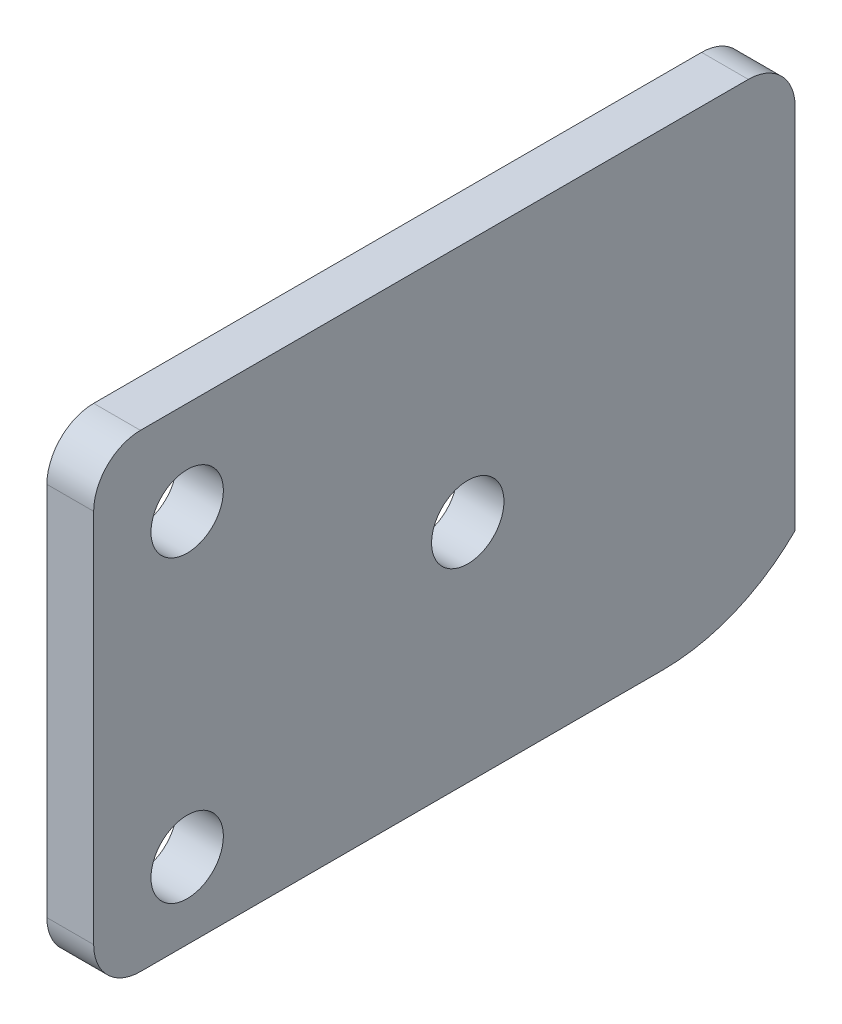
ISO-10303-21;
HEADER;
FILE_DESCRIPTION(('STEP AP214'),'2;1');
FILE_NAME('part.step','',(''),(''),'','','');
FILE_SCHEMA(('AUTOMOTIVE_DESIGN { 1 0 10303 214 1 1 1 1 }'));
ENDSEC;
DATA;
#1=APPLICATION_CONTEXT('core data for automotive mechanical design processes');
#2=APPLICATION_PROTOCOL_DEFINITION('international standard','automotive_design',2000,#1);
#3=PRODUCT_CONTEXT('',#1,'mechanical');
#4=PRODUCT('Part','Part','',(#3));
#5=PRODUCT_RELATED_PRODUCT_CATEGORY('part','',(#4));
#6=PRODUCT_DEFINITION_FORMATION('','',#4);
#7=PRODUCT_DEFINITION_CONTEXT('part definition',#1,'design');
#8=PRODUCT_DEFINITION('design','',#6,#7);
#9=PRODUCT_DEFINITION_SHAPE('','',#8);
#10=(LENGTH_UNIT() NAMED_UNIT(*) SI_UNIT(.MILLI.,.METRE.));
#11=(NAMED_UNIT(*) PLANE_ANGLE_UNIT() SI_UNIT($,.RADIAN.));
#12=(NAMED_UNIT(*) SI_UNIT($,.STERADIAN.) SOLID_ANGLE_UNIT());
#13=UNCERTAINTY_MEASURE_WITH_UNIT(LENGTH_MEASURE(1.E-05),#10,'distance_accuracy_value','');
#14=(GEOMETRIC_REPRESENTATION_CONTEXT(3) GLOBAL_UNCERTAINTY_ASSIGNED_CONTEXT((#13)) GLOBAL_UNIT_ASSIGNED_CONTEXT((#10,
#11,#12)) REPRESENTATION_CONTEXT('',''));
#15=CARTESIAN_POINT('',(0.,0.,0.));
#16=DIRECTION('',(0.,0.,1.));
#17=DIRECTION('',(1.,0.,0.));
#18=AXIS2_PLACEMENT_3D('',#15,#16,#17);
#19=CARTESIAN_POINT('',(3.175,11.1125,25.4));
#20=DIRECTION('',(0.,0.,-1.));
#21=DIRECTION('',(0.,1.,0.));
#22=AXIS2_PLACEMENT_3D('',#19,#20,#21);
#23=PLANE('',#22);
#24=DIRECTION('',(0.,-1.,0.));
#25=VECTOR('',#24,1.);
#26=CARTESIAN_POINT('',(3.175,11.1125,25.4));
#27=LINE('',#26,#25);
#28=CARTESIAN_POINT('',(3.175,7.93749999999999,25.4));
#29=VERTEX_POINT('',#28);
#30=CARTESIAN_POINT('',(3.175,-17.5416811648555,25.4));
#31=VERTEX_POINT('',#30);
#32=EDGE_CURVE('E114',#29,#31,#27,.T.);
#33=ORIENTED_EDGE('',*,*,#32,.F.);
#34=DIRECTION('',(-1.,0.,0.));
#35=VECTOR('',#34,1.);
#36=CARTESIAN_POINT('',(3.175,7.93749999999999,25.4));
#37=LINE('',#36,#35);
#38=CARTESIAN_POINT('',(0.,7.93749999999999,25.4));
#39=VERTEX_POINT('',#38);
#40=EDGE_CURVE('E48',#29,#39,#37,.T.);
#41=ORIENTED_EDGE('',*,*,#40,.T.);
#42=DIRECTION('',(0.,-1.,0.));
#43=VECTOR('',#42,1.);
#44=CARTESIAN_POINT('',(0.,11.1125,25.4));
#45=LINE('',#44,#43);
#46=CARTESIAN_POINT('',(0.,-17.5416811648555,25.4));
#47=VERTEX_POINT('',#46);
#48=EDGE_CURVE('E141',#39,#47,#45,.T.);
#49=ORIENTED_EDGE('',*,*,#48,.T.);
#50=DIRECTION('',(-1.,0.,0.));
#51=VECTOR('',#50,1.);
#52=CARTESIAN_POINT('',(3.175,-17.5416811648555,25.4));
#53=LINE('',#52,#51);
#54=EDGE_CURVE('E63',#47,#31,#53,.F.);
#55=ORIENTED_EDGE('',*,*,#54,.T.);
#56=EDGE_LOOP('',(#33,#41,#49,#55));
#57=FACE_BOUND('',#56,.T.);
#58=ADVANCED_FACE('F39',(#57),#23,.F.);
#59=CARTESIAN_POINT('',(3.175,-20.7166811648555,25.4));
#60=DIRECTION('',(0.,1.,0.));
#61=DIRECTION('',(0.,0.,1.));
#62=AXIS2_PLACEMENT_3D('',#59,#60,#61);
#63=PLANE('',#62);
#64=DIRECTION('',(0.,0.,-1.));
#65=VECTOR('',#64,1.);
#66=CARTESIAN_POINT('',(3.175,-20.7166811648555,25.4));
#67=LINE('',#66,#65);
#68=CARTESIAN_POINT('',(3.175,-20.7166811648555,22.225));
#69=VERTEX_POINT('',#68);
#70=CARTESIAN_POINT('',(3.175,-20.7166811648555,-13.2578493623623));
#71=VERTEX_POINT('',#70);
#72=EDGE_CURVE('E104',#69,#71,#67,.T.);
#73=ORIENTED_EDGE('',*,*,#72,.F.);
#74=DIRECTION('',(-1.,0.,0.));
#75=VECTOR('',#74,1.);
#76=CARTESIAN_POINT('',(3.175,-20.7166811648555,22.225));
#77=LINE('',#76,#75);
#78=CARTESIAN_POINT('',(0.,-20.7166811648555,22.225));
#79=VERTEX_POINT('',#78);
#80=EDGE_CURVE('E11',#69,#79,#77,.T.);
#81=ORIENTED_EDGE('',*,*,#80,.T.);
#82=DIRECTION('',(0.,0.,-1.));
#83=VECTOR('',#82,1.);
#84=CARTESIAN_POINT('',(0.,-20.7166811648555,25.4));
#85=LINE('',#84,#83);
#86=CARTESIAN_POINT('',(0.,-20.7166811648555,-13.2578493623623));
#87=VERTEX_POINT('',#86);
#88=EDGE_CURVE('E120',#79,#87,#85,.T.);
#89=ORIENTED_EDGE('',*,*,#88,.T.);
#90=DIRECTION('',(-1.,0.,0.));
#91=VECTOR('',#90,1.);
#92=CARTESIAN_POINT('',(3.175,-20.7166811648555,-13.2578493623623));
#93=LINE('',#92,#91);
#94=EDGE_CURVE('E117',#71,#87,#93,.T.);
#95=ORIENTED_EDGE('',*,*,#94,.F.);
#96=EDGE_LOOP('',(#73,#81,#89,#95));
#97=FACE_BOUND('',#96,.T.);
#98=ADVANCED_FACE('F118',(#97),#63,.F.);
#99=CARTESIAN_POINT('',(3.175,-8.01668116485554,-13.2578493623623));
#100=DIRECTION('',(-1.,0.,0.));
#101=DIRECTION('',(0.,0.,1.));
#102=AXIS2_PLACEMENT_3D('',#99,#100,#101);
#103=CYLINDRICAL_SURFACE('',#102,12.7);
#104=CARTESIAN_POINT('',(0.,-8.01668116485554,-13.2578493623623));
#105=DIRECTION('',(1.,0.,0.));
#106=DIRECTION('',(0.,0.,-1.));
#107=AXIS2_PLACEMENT_3D('',#104,#105,#106);
#108=CIRCLE('',#107,12.7);
#109=CARTESIAN_POINT('',(0.,-17.0100236715053,-22.225));
#110=VERTEX_POINT('',#109);
#111=EDGE_CURVE('E147',#87,#110,#108,.T.);
#112=ORIENTED_EDGE('',*,*,#111,.T.);
#113=DIRECTION('',(-1.,0.,0.));
#114=VECTOR('',#113,1.);
#115=CARTESIAN_POINT('',(3.175,-17.0100236715053,-22.225));
#116=LINE('',#115,#114);
#117=CARTESIAN_POINT('',(3.175,-17.0100236715053,-22.225));
#118=VERTEX_POINT('',#117);
#119=EDGE_CURVE('E125',#118,#110,#116,.T.);
#120=ORIENTED_EDGE('',*,*,#119,.F.);
#121=CARTESIAN_POINT('',(3.175,-8.01668116485554,-13.2578493623623));
#122=DIRECTION('',(1.,0.,0.));
#123=DIRECTION('',(0.,0.,-1.));
#124=AXIS2_PLACEMENT_3D('',#121,#122,#123);
#125=CIRCLE('',#124,12.7);
#126=EDGE_CURVE('E109',#71,#118,#125,.T.);
#127=ORIENTED_EDGE('',*,*,#126,.F.);
#128=ORIENTED_EDGE('',*,*,#94,.T.);
#129=EDGE_LOOP('',(#112,#120,#127,#128));
#130=FACE_BOUND('',#129,.T.);
#131=ADVANCED_FACE('F127',(#130),#103,.T.);
#132=CARTESIAN_POINT('',(3.175,11.1125,-22.225));
#133=DIRECTION('',(0.,0.,1.));
#134=DIRECTION('',(0.,-1.,0.));
#135=AXIS2_PLACEMENT_3D('',#132,#133,#134);
#136=PLANE('',#135);
#137=DIRECTION('',(0.,1.,0.));
#138=VECTOR('',#137,1.);
#139=CARTESIAN_POINT('',(0.,11.1125,-22.225));
#140=LINE('',#139,#138);
#141=CARTESIAN_POINT('',(0.,7.93749999999999,-22.225));
#142=VERTEX_POINT('',#141);
#143=EDGE_CURVE('E150',#110,#142,#140,.T.);
#144=ORIENTED_EDGE('',*,*,#143,.T.);
#145=DIRECTION('',(-1.,0.,0.));
#146=VECTOR('',#145,1.);
#147=CARTESIAN_POINT('',(3.175,7.93749999999999,-22.225));
#148=LINE('',#147,#146);
#149=CARTESIAN_POINT('',(3.175,7.93749999999999,-22.225));
#150=VERTEX_POINT('',#149);
#151=EDGE_CURVE('E175',#142,#150,#148,.F.);
#152=ORIENTED_EDGE('',*,*,#151,.T.);
#153=DIRECTION('',(0.,1.,0.));
#154=VECTOR('',#153,1.);
#155=CARTESIAN_POINT('',(3.175,11.1125,-22.225));
#156=LINE('',#155,#154);
#157=EDGE_CURVE('E131',#118,#150,#156,.T.);
#158=ORIENTED_EDGE('',*,*,#157,.F.);
#159=ORIENTED_EDGE('',*,*,#119,.T.);
#160=EDGE_LOOP('',(#144,#152,#158,#159));
#161=FACE_BOUND('',#160,.T.);
#162=ADVANCED_FACE('F276',(#161),#136,.F.);
#163=CARTESIAN_POINT('',(3.175,11.1125,25.4));
#164=DIRECTION('',(0.,-1.,0.));
#165=DIRECTION('',(0.,0.,-1.));
#166=AXIS2_PLACEMENT_3D('',#163,#164,#165);
#167=PLANE('',#166);
#168=DIRECTION('',(0.,0.,1.));
#169=VECTOR('',#168,1.);
#170=CARTESIAN_POINT('',(3.175,11.1125,25.4));
#171=LINE('',#170,#169);
#172=CARTESIAN_POINT('',(3.175,11.1125,-19.05));
#173=VERTEX_POINT('',#172);
#174=CARTESIAN_POINT('',(3.175,11.1125,22.225));
#175=VERTEX_POINT('',#174);
#176=EDGE_CURVE('E134',#173,#175,#171,.T.);
#177=ORIENTED_EDGE('',*,*,#176,.F.);
#178=DIRECTION('',(-1.,0.,0.));
#179=VECTOR('',#178,1.);
#180=CARTESIAN_POINT('',(3.175,11.1125,-19.05));
#181=LINE('',#180,#179);
#182=CARTESIAN_POINT('',(0.,11.1125,-19.05));
#183=VERTEX_POINT('',#182);
#184=EDGE_CURVE('E162',#173,#183,#181,.T.);
#185=ORIENTED_EDGE('',*,*,#184,.T.);
#186=DIRECTION('',(0.,0.,1.));
#187=VECTOR('',#186,1.);
#188=CARTESIAN_POINT('',(0.,11.1125,25.4));
#189=LINE('',#188,#187);
#190=CARTESIAN_POINT('',(0.,11.1125,22.225));
#191=VERTEX_POINT('',#190);
#192=EDGE_CURVE('E154',#183,#191,#189,.T.);
#193=ORIENTED_EDGE('',*,*,#192,.T.);
#194=DIRECTION('',(-1.,0.,0.));
#195=VECTOR('',#194,1.);
#196=CARTESIAN_POINT('',(3.175,11.1125,22.225));
#197=LINE('',#196,#195);
#198=EDGE_CURVE('E124',#191,#175,#197,.F.);
#199=ORIENTED_EDGE('',*,*,#198,.T.);
#200=EDGE_LOOP('',(#177,#185,#193,#199));
#201=FACE_BOUND('',#200,.T.);
#202=ADVANCED_FACE('F225',(#201),#167,.F.);
#203=CARTESIAN_POINT('',(3.175,-8.01668116485554,-13.2578493623623));
#204=DIRECTION('',(1.,0.,0.));
#205=DIRECTION('',(0.,0.,-1.));
#206=AXIS2_PLACEMENT_3D('',#203,#204,#205);
#207=PLANE('',#206);
#208=CARTESIAN_POINT('',(3.175,4.7625,19.05));
#209=DIRECTION('',(1.,0.,0.));
#210=DIRECTION('',(0.,0.,-1.));
#211=AXIS2_PLACEMENT_3D('',#208,#209,#210);
#212=CIRCLE('',#211,2.45744999999999);
#213=CARTESIAN_POINT('',(3.175,4.7625,16.59255));
#214=VERTEX_POINT('',#213);
#215=EDGE_CURVE('E244',#214,#214,#212,.T.);
#216=ORIENTED_EDGE('',*,*,#215,.F.);
#217=EDGE_LOOP('',(#216));
#218=FACE_BOUND('',#217,.T.);
#219=CARTESIAN_POINT('',(3.175,-15.5575,19.05));
#220=DIRECTION('',(1.,0.,0.));
#221=DIRECTION('',(0.,0.,-1.));
#222=AXIS2_PLACEMENT_3D('',#219,#220,#221);
#223=CIRCLE('',#222,2.45744999999999);
#224=CARTESIAN_POINT('',(3.175,-15.5575,16.59255));
#225=VERTEX_POINT('',#224);
#226=EDGE_CURVE('E236',#225,#225,#223,.T.);
#227=ORIENTED_EDGE('',*,*,#226,.F.);
#228=EDGE_LOOP('',(#227));
#229=FACE_BOUND('',#228,.T.);
#230=CARTESIAN_POINT('',(3.175,-5.3975,0.));
#231=DIRECTION('',(1.,0.,0.));
#232=DIRECTION('',(0.,0.,-1.));
#233=AXIS2_PLACEMENT_3D('',#230,#231,#232);
#234=CIRCLE('',#233,2.45744999999999);
#235=CARTESIAN_POINT('',(3.175,-5.3975,-2.45744999999999));
#236=VERTEX_POINT('',#235);
#237=EDGE_CURVE('E144',#236,#236,#234,.T.);
#238=ORIENTED_EDGE('',*,*,#237,.F.);
#239=EDGE_LOOP('',(#238));
#240=FACE_BOUND('',#239,.T.);
#241=ORIENTED_EDGE('',*,*,#157,.T.);
#242=CARTESIAN_POINT('',(3.175,7.93749999999999,-19.05));
#243=DIRECTION('',(1.,0.,0.));
#244=DIRECTION('',(0.,0.,-1.));
#245=AXIS2_PLACEMENT_3D('',#242,#243,#244);
#246=CIRCLE('',#245,3.175);
#247=EDGE_CURVE('E183',#150,#173,#246,.T.);
#248=ORIENTED_EDGE('',*,*,#247,.T.);
#249=ORIENTED_EDGE('',*,*,#176,.T.);
#250=CARTESIAN_POINT('',(3.175,7.93749999999999,22.225));
#251=DIRECTION('',(1.,0.,0.));
#252=DIRECTION('',(0.,0.,-1.));
#253=AXIS2_PLACEMENT_3D('',#250,#251,#252);
#254=CIRCLE('',#253,3.175);
#255=EDGE_CURVE('E180',#175,#29,#254,.T.);
#256=ORIENTED_EDGE('',*,*,#255,.T.);
#257=ORIENTED_EDGE('',*,*,#32,.T.);
#258=CARTESIAN_POINT('',(3.175,-17.5416811648555,22.225));
#259=DIRECTION('',(1.,0.,0.));
#260=DIRECTION('',(0.,0.,-1.));
#261=AXIS2_PLACEMENT_3D('',#258,#259,#260);
#262=CIRCLE('',#261,3.175);
#263=EDGE_CURVE('E55',#31,#69,#262,.T.);
#264=ORIENTED_EDGE('',*,*,#263,.T.);
#265=ORIENTED_EDGE('',*,*,#72,.T.);
#266=ORIENTED_EDGE('',*,*,#126,.T.);
#267=EDGE_LOOP('',(#241,#248,#249,#256,#257,#264,#265,#266));
#268=FACE_BOUND('',#267,.T.);
#269=ADVANCED_FACE('F107',(#218,#229,#240,#268),#207,.T.);
#270=CARTESIAN_POINT('',(0.,-8.01668116485554,-13.2578493623623));
#271=DIRECTION('',(1.,0.,0.));
#272=DIRECTION('',(0.,0.,-1.));
#273=AXIS2_PLACEMENT_3D('',#270,#271,#272);
#274=PLANE('',#273);
#275=CARTESIAN_POINT('',(0.,4.7625,19.05));
#276=DIRECTION('',(-1.,0.,0.));
#277=DIRECTION('',(0.,0.,1.));
#278=AXIS2_PLACEMENT_3D('',#275,#276,#277);
#279=CIRCLE('',#278,2.45744999999999);
#280=CARTESIAN_POINT('',(0.,4.7625,21.50745));
#281=VERTEX_POINT('',#280);
#282=EDGE_CURVE('E248',#281,#281,#279,.T.);
#283=ORIENTED_EDGE('',*,*,#282,.F.);
#284=EDGE_LOOP('',(#283));
#285=FACE_BOUND('',#284,.T.);
#286=CARTESIAN_POINT('',(0.,-15.5575,19.05));
#287=DIRECTION('',(-1.,0.,0.));
#288=DIRECTION('',(0.,0.,1.));
#289=AXIS2_PLACEMENT_3D('',#286,#287,#288);
#290=CIRCLE('',#289,2.45744999999999);
#291=CARTESIAN_POINT('',(0.,-15.5575,21.50745));
#292=VERTEX_POINT('',#291);
#293=EDGE_CURVE('E240',#292,#292,#290,.T.);
#294=ORIENTED_EDGE('',*,*,#293,.F.);
#295=EDGE_LOOP('',(#294));
#296=FACE_BOUND('',#295,.T.);
#297=CARTESIAN_POINT('',(0.,-5.3975,0.));
#298=DIRECTION('',(-1.,0.,0.));
#299=DIRECTION('',(0.,0.,1.));
#300=AXIS2_PLACEMENT_3D('',#297,#298,#299);
#301=CIRCLE('',#300,2.45744999999999);
#302=CARTESIAN_POINT('',(0.,-5.3975,2.45744999999999));
#303=VERTEX_POINT('',#302);
#304=EDGE_CURVE('E232',#303,#303,#301,.T.);
#305=ORIENTED_EDGE('',*,*,#304,.F.);
#306=EDGE_LOOP('',(#305));
#307=FACE_BOUND('',#306,.T.);
#308=ORIENTED_EDGE('',*,*,#192,.F.);
#309=CARTESIAN_POINT('',(0.,7.93749999999999,-19.05));
#310=DIRECTION('',(1.,0.,0.));
#311=DIRECTION('',(0.,0.,-1.));
#312=AXIS2_PLACEMENT_3D('',#309,#310,#311);
#313=CIRCLE('',#312,3.175);
#314=EDGE_CURVE('E172',#183,#142,#313,.F.);
#315=ORIENTED_EDGE('',*,*,#314,.T.);
#316=ORIENTED_EDGE('',*,*,#143,.F.);
#317=ORIENTED_EDGE('',*,*,#111,.F.);
#318=ORIENTED_EDGE('',*,*,#88,.F.);
#319=CARTESIAN_POINT('',(0.,-17.5416811648555,22.225));
#320=DIRECTION('',(1.,0.,0.));
#321=DIRECTION('',(0.,0.,-1.));
#322=AXIS2_PLACEMENT_3D('',#319,#320,#321);
#323=CIRCLE('',#322,3.175);
#324=EDGE_CURVE('E166',#79,#47,#323,.F.);
#325=ORIENTED_EDGE('',*,*,#324,.T.);
#326=ORIENTED_EDGE('',*,*,#48,.F.);
#327=CARTESIAN_POINT('',(0.,7.93749999999999,22.225));
#328=DIRECTION('',(1.,0.,0.));
#329=DIRECTION('',(0.,0.,-1.));
#330=AXIS2_PLACEMENT_3D('',#327,#328,#329);
#331=CIRCLE('',#330,3.175);
#332=EDGE_CURVE('E169',#39,#191,#331,.F.);
#333=ORIENTED_EDGE('',*,*,#332,.T.);
#334=EDGE_LOOP('',(#308,#315,#316,#317,#318,#325,#326,#333));
#335=FACE_BOUND('',#334,.T.);
#336=ADVANCED_FACE('F195',(#285,#296,#307,#335),#274,.F.);
#337=CARTESIAN_POINT('',(0.,-5.3975,0.));
#338=DIRECTION('',(-1.,0.,0.));
#339=DIRECTION('',(0.,0.,1.));
#340=AXIS2_PLACEMENT_3D('',#337,#338,#339);
#341=CYLINDRICAL_SURFACE('',#340,2.45744999999999);
#342=ORIENTED_EDGE('',*,*,#237,.T.);
#343=EDGE_LOOP('',(#342));
#344=FACE_BOUND('',#343,.T.);
#345=ORIENTED_EDGE('',*,*,#304,.T.);
#346=EDGE_LOOP('',(#345));
#347=FACE_BOUND('',#346,.T.);
#348=ADVANCED_FACE('F256',(#344,#347),#341,.F.);
#349=CARTESIAN_POINT('',(0.,-15.5575,19.05));
#350=DIRECTION('',(-1.,0.,0.));
#351=DIRECTION('',(0.,0.,1.));
#352=AXIS2_PLACEMENT_3D('',#349,#350,#351);
#353=CYLINDRICAL_SURFACE('',#352,2.45744999999999);
#354=ORIENTED_EDGE('',*,*,#226,.T.);
#355=EDGE_LOOP('',(#354));
#356=FACE_BOUND('',#355,.T.);
#357=ORIENTED_EDGE('',*,*,#293,.T.);
#358=EDGE_LOOP('',(#357));
#359=FACE_BOUND('',#358,.T.);
#360=ADVANCED_FACE('F217',(#356,#359),#353,.F.);
#361=CARTESIAN_POINT('',(0.,4.7625,19.05));
#362=DIRECTION('',(-1.,0.,0.));
#363=DIRECTION('',(0.,0.,1.));
#364=AXIS2_PLACEMENT_3D('',#361,#362,#363);
#365=CYLINDRICAL_SURFACE('',#364,2.45744999999999);
#366=ORIENTED_EDGE('',*,*,#215,.T.);
#367=EDGE_LOOP('',(#366));
#368=FACE_BOUND('',#367,.T.);
#369=ORIENTED_EDGE('',*,*,#282,.T.);
#370=EDGE_LOOP('',(#369));
#371=FACE_BOUND('',#370,.T.);
#372=ADVANCED_FACE('F212',(#368,#371),#365,.F.);
#373=CARTESIAN_POINT('',(3.175,7.93749999999999,-19.05));
#374=DIRECTION('',(-1.,0.,0.));
#375=DIRECTION('',(0.,0.,1.));
#376=AXIS2_PLACEMENT_3D('',#373,#374,#375);
#377=CYLINDRICAL_SURFACE('',#376,3.175);
#378=ORIENTED_EDGE('',*,*,#247,.F.);
#379=ORIENTED_EDGE('',*,*,#151,.F.);
#380=ORIENTED_EDGE('',*,*,#314,.F.);
#381=ORIENTED_EDGE('',*,*,#184,.F.);
#382=EDGE_LOOP('',(#378,#379,#380,#381));
#383=FACE_BOUND('',#382,.T.);
#384=ADVANCED_FACE('F202',(#383),#377,.T.);
#385=CARTESIAN_POINT('',(3.175,7.93749999999999,22.225));
#386=DIRECTION('',(-1.,0.,0.));
#387=DIRECTION('',(0.,0.,1.));
#388=AXIS2_PLACEMENT_3D('',#385,#386,#387);
#389=CYLINDRICAL_SURFACE('',#388,3.175);
#390=ORIENTED_EDGE('',*,*,#255,.F.);
#391=ORIENTED_EDGE('',*,*,#198,.F.);
#392=ORIENTED_EDGE('',*,*,#332,.F.);
#393=ORIENTED_EDGE('',*,*,#40,.F.);
#394=EDGE_LOOP('',(#390,#391,#392,#393));
#395=FACE_BOUND('',#394,.T.);
#396=ADVANCED_FACE('F198',(#395),#389,.T.);
#397=CARTESIAN_POINT('',(3.175,-17.5416811648555,22.225));
#398=DIRECTION('',(-1.,0.,0.));
#399=DIRECTION('',(0.,0.,1.));
#400=AXIS2_PLACEMENT_3D('',#397,#398,#399);
#401=CYLINDRICAL_SURFACE('',#400,3.175);
#402=ORIENTED_EDGE('',*,*,#263,.F.);
#403=ORIENTED_EDGE('',*,*,#54,.F.);
#404=ORIENTED_EDGE('',*,*,#324,.F.);
#405=ORIENTED_EDGE('',*,*,#80,.F.);
#406=EDGE_LOOP('',(#402,#403,#404,#405));
#407=FACE_BOUND('',#406,.T.);
#408=ADVANCED_FACE('F41',(#407),#401,.T.);
#409=CLOSED_SHELL('',(#58,#98,#131,#162,#202,#269,#336,#348,#360,#372,#384,#396,#408));
#410=MANIFOLD_SOLID_BREP('B2',#409);
#411=ADVANCED_BREP_SHAPE_REPRESENTATION('',(#18,#410),#14);
#412=SHAPE_DEFINITION_REPRESENTATION(#9,#411);
ENDSEC;
END-ISO-10303-21;
